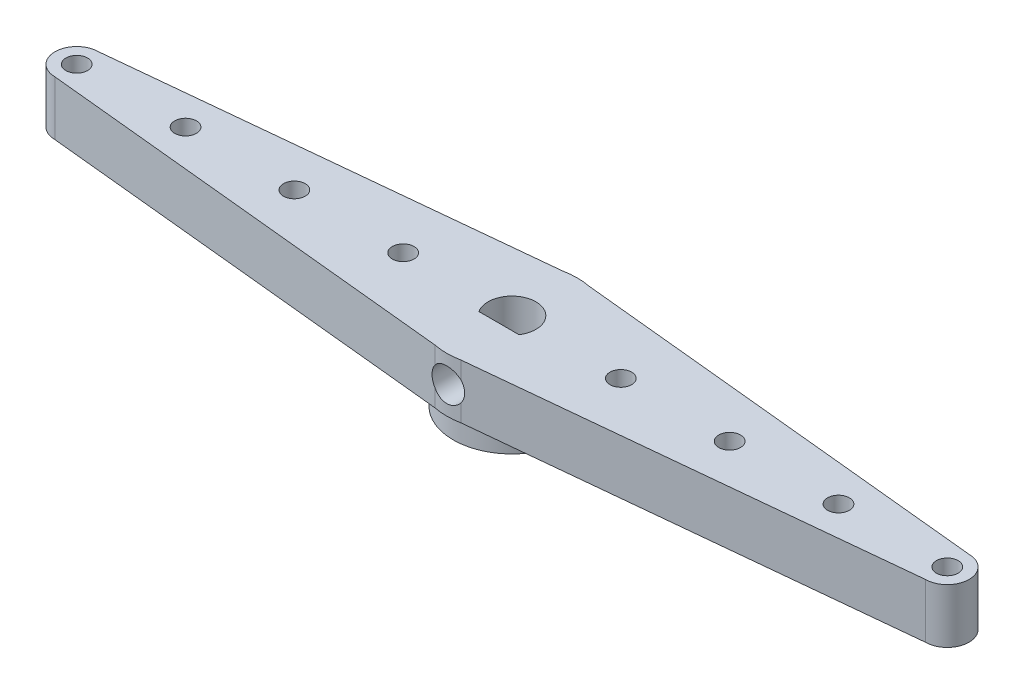
ISO-10303-21;
HEADER;
FILE_DESCRIPTION(('STEP AP214'),'2;1');
FILE_NAME('part.step','',(''),(''),'','','');
FILE_SCHEMA(('AUTOMOTIVE_DESIGN { 1 0 10303 214 1 1 1 1 }'));
ENDSEC;
DATA;
#1=APPLICATION_CONTEXT('core data for automotive mechanical design processes');
#2=APPLICATION_PROTOCOL_DEFINITION('international standard','automotive_design',2000,#1);
#3=PRODUCT_CONTEXT('',#1,'mechanical');
#4=PRODUCT('Part','Part','',(#3));
#5=PRODUCT_RELATED_PRODUCT_CATEGORY('part','',(#4));
#6=PRODUCT_DEFINITION_FORMATION('','',#4);
#7=PRODUCT_DEFINITION_CONTEXT('part definition',#1,'design');
#8=PRODUCT_DEFINITION('design','',#6,#7);
#9=PRODUCT_DEFINITION_SHAPE('','',#8);
#10=(LENGTH_UNIT() NAMED_UNIT(*) SI_UNIT(.MILLI.,.METRE.));
#11=(NAMED_UNIT(*) PLANE_ANGLE_UNIT() SI_UNIT($,.RADIAN.));
#12=(NAMED_UNIT(*) SI_UNIT($,.STERADIAN.) SOLID_ANGLE_UNIT());
#13=UNCERTAINTY_MEASURE_WITH_UNIT(LENGTH_MEASURE(1.E-05),#10,'distance_accuracy_value','');
#14=(GEOMETRIC_REPRESENTATION_CONTEXT(3) GLOBAL_UNCERTAINTY_ASSIGNED_CONTEXT((#13)) GLOBAL_UNIT_ASSIGNED_CONTEXT((#10,
#11,#12)) REPRESENTATION_CONTEXT('',''));
#15=CARTESIAN_POINT('',(0.,0.,0.));
#16=DIRECTION('',(0.,0.,1.));
#17=DIRECTION('',(1.,0.,0.));
#18=AXIS2_PLACEMENT_3D('',#15,#16,#17);
#19=CARTESIAN_POINT('',(-20.,0.,0.));
#20=DIRECTION('',(0.,-1.,0.));
#21=DIRECTION('',(0.,0.,-1.));
#22=AXIS2_PLACEMENT_3D('',#19,#20,#21);
#23=PLANE('',#22);
#24=DIRECTION('',(1.,0.,0.));
#25=VECTOR('',#24,1.);
#26=CARTESIAN_POINT('',(-0.921954445729289,0.,0.6));
#27=LINE('',#26,#25);
#28=CARTESIAN_POINT('',(-0.921954445729289,0.,0.6));
#29=VERTEX_POINT('',#28);
#30=CARTESIAN_POINT('',(0.921954445729286,0.,0.6));
#31=VERTEX_POINT('',#30);
#32=EDGE_CURVE('E285',#29,#31,#27,.T.);
#33=ORIENTED_EDGE('',*,*,#32,.T.);
#34=CARTESIAN_POINT('',(0.,0.,0.));
#35=DIRECTION('',(0.,1.,0.));
#36=DIRECTION('',(0.,0.,1.));
#37=AXIS2_PLACEMENT_3D('',#34,#35,#36);
#38=CIRCLE('',#37,1.1);
#39=EDGE_CURVE('E483',#31,#29,#38,.T.);
#40=ORIENTED_EDGE('',*,*,#39,.T.);
#41=EDGE_LOOP('',(#33,#40));
#42=FACE_BOUND('',#41,.T.);
#43=CARTESIAN_POINT('',(0.,0.,0.));
#44=DIRECTION('',(0.,1.,0.));
#45=DIRECTION('',(0.,0.,1.));
#46=AXIS2_PLACEMENT_3D('',#43,#44,#45);
#47=CIRCLE('',#46,2.);
#48=CARTESIAN_POINT('',(0.,0.,2.));
#49=VERTEX_POINT('',#48);
#50=EDGE_CURVE('E182',#49,#49,#47,.T.);
#51=ORIENTED_EDGE('',*,*,#50,.F.);
#52=EDGE_LOOP('',(#51));
#53=FACE_BOUND('',#52,.T.);
#54=ADVANCED_FACE('F43',(#42,#53),#23,.T.);
#55=CARTESIAN_POINT('',(0.,2.5,0.));
#56=DIRECTION('',(0.,-1.,0.));
#57=DIRECTION('',(0.,0.,-1.));
#58=AXIS2_PLACEMENT_3D('',#55,#56,#57);
#59=CYLINDRICAL_SURFACE('',#58,3.);
#60=CARTESIAN_POINT('',(-0.594059405940595,0.792186258164407,2.94059405940594));
#61=CARTESIAN_POINT('',(-0.568276606003734,0.758685202406999,2.94581106956322));
#62=CARTESIAN_POINT('',(-0.539639583970828,0.727423837590144,2.95123654479784));
#63=CARTESIAN_POINT('',(-0.477504194017472,0.670115946895208,2.9619198478612));
#64=CARTESIAN_POINT('',(-0.444004007325869,0.644071380754388,2.96717761206652));
#65=CARTESIAN_POINT('',(-0.372982275206844,0.597940773804355,2.9769399353054));
#66=CARTESIAN_POINT('',(-0.335457608352631,0.577859404272306,2.98144390265242));
#67=CARTESIAN_POINT('',(-0.257462397587267,0.544299578450418,2.98918804670013));
#68=CARTESIAN_POINT('',(-0.216993648353223,0.530817137637052,2.99242898579306));
#69=CARTESIAN_POINT('',(-0.134922093114569,0.511048517968992,2.99724177000638));
#70=CARTESIAN_POINT('',(-0.0933476403781332,0.504651073231695,2.99883939311242));
#71=CARTESIAN_POINT('',(-0.0096789665313658,0.498891270089852,3.00027600152797));
#72=CARTESIAN_POINT('',(0.032415276965879,0.499529215756191,3.00011491082555));
#73=CARTESIAN_POINT('',(0.114922578095821,0.507724185212947,2.99807584676848));
#74=CARTESIAN_POINT('',(0.155352171573688,0.51512585034932,2.99623642512177));
#75=CARTESIAN_POINT('',(0.234381817821163,0.536389625219354,2.99109247997884));
#76=CARTESIAN_POINT('',(0.272981555374788,0.550252843614597,2.98778770506471));
#77=CARTESIAN_POINT('',(0.347658596899154,0.584168170241157,2.98002646408354));
#78=CARTESIAN_POINT('',(0.383709245627547,0.604276376264111,2.9755596208857));
#79=CARTESIAN_POINT('',(0.451956317255789,0.650065937581668,2.96596064509335));
#80=CARTESIAN_POINT('',(0.484155823111139,0.675742788047969,2.96082905160077));
#81=CARTESIAN_POINT('',(0.528515219108444,0.717487518749236,2.95311525900234));
#82=CARTESIAN_POINT('',(0.542464902419456,0.731706077476062,2.95057916647666));
#83=CARTESIAN_POINT('',(0.569166888450158,0.761181830901836,2.94554454049115));
#84=CARTESIAN_POINT('',(0.581921442077907,0.776436975791388,2.94304594418521));
#85=CARTESIAN_POINT('',(0.594059405940596,0.792186258164408,2.94059405940594));
#86=B_SPLINE_CURVE_WITH_KNOTS('',3,(#60,#61,#62,#63,#64,#65,#66,#67,#68,#69,#70,#71,#72,#73,#74,
#75,#76,#77,#78,#79,#80,#81,#82,#83,#84,#85),.UNSPECIFIED.,.F.,.F.,(4,2,2,2,2,2,2,2,2,2,2,2,4),
(0.,0.127625211159938,0.255298276329441,0.383071092101845,0.510766661426294,0.636427081665982,
0.762092932993769,0.884942943019022,1.00781403918979,1.13182245380267,1.25573092190355,
1.31591641640539,1.37598617787841),.UNSPECIFIED.);
#87=CARTESIAN_POINT('',(-0.594059405940595,0.792186258164407,2.94059405940594));
#88=VERTEX_POINT('',#87);
#89=CARTESIAN_POINT('',(0.594059405940597,0.792186258164409,2.94059405940594));
#90=VERTEX_POINT('',#89);
#91=EDGE_CURVE('E59',#88,#90,#86,.T.);
#92=ORIENTED_EDGE('',*,*,#91,.F.);
#93=DIRECTION('',(0.,-1.,0.));
#94=VECTOR('',#93,1.);
#95=CARTESIAN_POINT('',(-0.594059405940597,2.5,2.94059405940594));
#96=LINE('',#95,#94);
#97=CARTESIAN_POINT('',(-0.594059405940597,0.,2.94059405940594));
#98=VERTEX_POINT('',#97);
#99=EDGE_CURVE('E156',#88,#98,#96,.T.);
#100=ORIENTED_EDGE('',*,*,#99,.T.);
#101=CARTESIAN_POINT('',(0.,0.,0.));
#102=DIRECTION('',(0.,1.,0.));
#103=DIRECTION('',(0.,0.,1.));
#104=AXIS2_PLACEMENT_3D('',#101,#102,#103);
#105=CIRCLE('',#104,3.);
#106=CARTESIAN_POINT('',(0.594059405940597,0.,2.94059405940594));
#107=VERTEX_POINT('',#106);
#108=EDGE_CURVE('E430',#98,#107,#105,.T.);
#109=ORIENTED_EDGE('',*,*,#108,.T.);
#110=DIRECTION('',(0.,-1.,0.));
#111=VECTOR('',#110,1.);
#112=CARTESIAN_POINT('',(0.594059405940597,2.5,2.94059405940594));
#113=LINE('',#112,#111);
#114=EDGE_CURVE('E157',#90,#107,#113,.T.);
#115=ORIENTED_EDGE('',*,*,#114,.F.);
#116=EDGE_LOOP('',(#92,#100,#109,#115));
#117=FACE_BOUND('',#116,.T.);
#118=ADVANCED_FACE('F197',(#117),#59,.T.);
#119=CARTESIAN_POINT('',(0.594059405940596,1.70781374183559,2.94059405940594));
#120=CARTESIAN_POINT('',(0.568276606003735,1.741314797593,2.94581106956322));
#121=CARTESIAN_POINT('',(0.539639583970829,1.77257616240986,2.95123654479784));
#122=CARTESIAN_POINT('',(0.477504194017473,1.82988405310479,2.9619198478612));
#123=CARTESIAN_POINT('',(0.44400400732587,1.85592861924561,2.96717761206652));
#124=CARTESIAN_POINT('',(0.372982275206845,1.90205922619564,2.9769399353054));
#125=CARTESIAN_POINT('',(0.335457608352632,1.92214059572769,2.98144390265242));
#126=CARTESIAN_POINT('',(0.257462397587268,1.95570042154958,2.98918804670013));
#127=CARTESIAN_POINT('',(0.216993648353224,1.96918286236295,2.99242898579306));
#128=CARTESIAN_POINT('',(0.13492209311457,1.98895148203101,2.99724177000638));
#129=CARTESIAN_POINT('',(0.0933476403781343,1.9953489267683,2.99883939311242));
#130=CARTESIAN_POINT('',(0.00967896653136686,2.00110872991015,3.00027600152797));
#131=CARTESIAN_POINT('',(-0.032415276965878,2.00047078424381,3.00011491082555));
#132=CARTESIAN_POINT('',(-0.11492257809582,1.99227581478705,2.99807584676848));
#133=CARTESIAN_POINT('',(-0.155352171573687,1.98487414965068,2.99623642512177));
#134=CARTESIAN_POINT('',(-0.234381817821162,1.96361037478065,2.99109247997884));
#135=CARTESIAN_POINT('',(-0.272981555374787,1.9497471563854,2.98778770506471));
#136=CARTESIAN_POINT('',(-0.347658596899153,1.91583182975884,2.98002646408354));
#137=CARTESIAN_POINT('',(-0.383709245627546,1.89572362373589,2.9755596208857));
#138=CARTESIAN_POINT('',(-0.451956317255788,1.84993406241833,2.96596064509336));
#139=CARTESIAN_POINT('',(-0.484155823111139,1.82425721195203,2.96082905160077));
#140=CARTESIAN_POINT('',(-0.528515219108443,1.78251248125076,2.95311525900234));
#141=CARTESIAN_POINT('',(-0.542464902419456,1.76829392252394,2.95057916647666));
#142=CARTESIAN_POINT('',(-0.569166888450157,1.73881816909816,2.94554454049115));
#143=CARTESIAN_POINT('',(-0.581921442077906,1.72356302420861,2.94304594418521));
#144=CARTESIAN_POINT('',(-0.594059405940595,1.70781374183559,2.94059405940594));
#145=B_SPLINE_CURVE_WITH_KNOTS('',3,(#119,#120,#121,#122,#123,#124,#125,#126,#127,#128,#129,
#130,#131,#132,#133,#134,#135,#136,#137,#138,#139,#140,#141,#142,#143,#144),.UNSPECIFIED.,.F.,
.F.,(4,2,2,2,2,2,2,2,2,2,2,2,4),(0.,0.127625211159938,0.255298276329441,0.383071092101845,
0.510766661426294,0.636427081665982,0.762092932993769,0.884942943019022,1.00781403918979,
1.13182245380267,1.25573092190355,1.31591641640539,1.37598617787841),.UNSPECIFIED.);
#146=CARTESIAN_POINT('',(0.594059405940597,1.70781374183559,2.94059405940594));
#147=VERTEX_POINT('',#146);
#148=CARTESIAN_POINT('',(-0.594059405940595,1.70781374183559,2.94059405940594));
#149=VERTEX_POINT('',#148);
#150=EDGE_CURVE('E133',#147,#149,#145,.T.);
#151=ORIENTED_EDGE('',*,*,#150,.F.);
#152=CARTESIAN_POINT('',(0.594059405940597,2.5,2.94059405940594));
#153=VERTEX_POINT('',#152);
#154=EDGE_CURVE('E146',#153,#147,#113,.T.);
#155=ORIENTED_EDGE('',*,*,#154,.F.);
#156=CARTESIAN_POINT('',(0.,2.5,0.));
#157=DIRECTION('',(0.,1.,0.));
#158=DIRECTION('',(0.,0.,1.));
#159=AXIS2_PLACEMENT_3D('',#156,#157,#158);
#160=CIRCLE('',#159,3.);
#161=CARTESIAN_POINT('',(-0.594059405940597,2.5,2.94059405940594));
#162=VERTEX_POINT('',#161);
#163=EDGE_CURVE('E406',#162,#153,#160,.T.);
#164=ORIENTED_EDGE('',*,*,#163,.F.);
#165=EDGE_CURVE('E149',#162,#149,#96,.T.);
#166=ORIENTED_EDGE('',*,*,#165,.T.);
#167=EDGE_LOOP('',(#151,#155,#164,#166));
#168=FACE_BOUND('',#167,.T.);
#169=ADVANCED_FACE('F144',(#168),#59,.T.);
#170=CARTESIAN_POINT('',(-20.,2.5,0.));
#171=DIRECTION('',(0.,-1.,0.));
#172=DIRECTION('',(0.,0.,-1.));
#173=AXIS2_PLACEMENT_3D('',#170,#171,#172);
#174=PLANE('',#173);
#175=CARTESIAN_POINT('',(-5.,2.5,0.));
#176=DIRECTION('',(0.,1.,0.));
#177=DIRECTION('',(0.,0.,-1.));
#178=AXIS2_PLACEMENT_3D('',#175,#176,#177);
#179=CIRCLE('',#178,0.500000000000001);
#180=CARTESIAN_POINT('',(-5.,2.5,-0.500000000000001));
#181=VERTEX_POINT('',#180);
#182=EDGE_CURVE('E347',#181,#181,#179,.T.);
#183=ORIENTED_EDGE('',*,*,#182,.F.);
#184=EDGE_LOOP('',(#183));
#185=FACE_BOUND('',#184,.T.);
#186=CARTESIAN_POINT('',(-10.,2.5,0.));
#187=DIRECTION('',(0.,1.,0.));
#188=DIRECTION('',(0.,0.,-1.));
#189=AXIS2_PLACEMENT_3D('',#186,#187,#188);
#190=CIRCLE('',#189,0.500000000000001);
#191=CARTESIAN_POINT('',(-10.,2.5,-0.500000000000001));
#192=VERTEX_POINT('',#191);
#193=EDGE_CURVE('E356',#192,#192,#190,.T.);
#194=ORIENTED_EDGE('',*,*,#193,.F.);
#195=EDGE_LOOP('',(#194));
#196=FACE_BOUND('',#195,.T.);
#197=CARTESIAN_POINT('',(-15.,2.5,0.));
#198=DIRECTION('',(0.,1.,0.));
#199=DIRECTION('',(0.,0.,-1.));
#200=AXIS2_PLACEMENT_3D('',#197,#198,#199);
#201=CIRCLE('',#200,0.500000000000002);
#202=CARTESIAN_POINT('',(-15.,2.5,-0.500000000000002));
#203=VERTEX_POINT('',#202);
#204=EDGE_CURVE('E362',#203,#203,#201,.T.);
#205=ORIENTED_EDGE('',*,*,#204,.F.);
#206=EDGE_LOOP('',(#205));
#207=FACE_BOUND('',#206,.T.);
#208=CARTESIAN_POINT('',(20.,2.5,0.));
#209=DIRECTION('',(0.,1.,0.));
#210=DIRECTION('',(0.,0.,1.));
#211=AXIS2_PLACEMENT_3D('',#208,#209,#210);
#212=CIRCLE('',#211,0.499999999999999);
#213=CARTESIAN_POINT('',(20.,2.5,0.499999999999999));
#214=VERTEX_POINT('',#213);
#215=EDGE_CURVE('E368',#214,#214,#212,.T.);
#216=ORIENTED_EDGE('',*,*,#215,.F.);
#217=EDGE_LOOP('',(#216));
#218=FACE_BOUND('',#217,.T.);
#219=CARTESIAN_POINT('',(15.,2.5,0.));
#220=DIRECTION('',(0.,1.,0.));
#221=DIRECTION('',(0.,0.,1.));
#222=AXIS2_PLACEMENT_3D('',#219,#220,#221);
#223=CIRCLE('',#222,0.500000000000002);
#224=CARTESIAN_POINT('',(15.,2.5,0.500000000000002));
#225=VERTEX_POINT('',#224);
#226=EDGE_CURVE('E374',#225,#225,#223,.T.);
#227=ORIENTED_EDGE('',*,*,#226,.F.);
#228=EDGE_LOOP('',(#227));
#229=FACE_BOUND('',#228,.T.);
#230=CARTESIAN_POINT('',(10.,2.5,0.));
#231=DIRECTION('',(0.,1.,0.));
#232=DIRECTION('',(0.,0.,1.));
#233=AXIS2_PLACEMENT_3D('',#230,#231,#232);
#234=CIRCLE('',#233,0.500000000000001);
#235=CARTESIAN_POINT('',(10.,2.5,0.500000000000001));
#236=VERTEX_POINT('',#235);
#237=EDGE_CURVE('E380',#236,#236,#234,.T.);
#238=ORIENTED_EDGE('',*,*,#237,.F.);
#239=EDGE_LOOP('',(#238));
#240=FACE_BOUND('',#239,.T.);
#241=CARTESIAN_POINT('',(-20.,2.5,0.));
#242=DIRECTION('',(0.,1.,0.));
#243=DIRECTION('',(0.,0.,-1.));
#244=AXIS2_PLACEMENT_3D('',#241,#242,#243);
#245=CIRCLE('',#244,0.499999999999999);
#246=CARTESIAN_POINT('',(-20.,2.5,-0.499999999999999));
#247=VERTEX_POINT('',#246);
#248=EDGE_CURVE('E386',#247,#247,#245,.T.);
#249=ORIENTED_EDGE('',*,*,#248,.F.);
#250=EDGE_LOOP('',(#249));
#251=FACE_BOUND('',#250,.T.);
#252=CARTESIAN_POINT('',(5.,2.5,0.));
#253=DIRECTION('',(0.,1.,0.));
#254=DIRECTION('',(0.,0.,1.));
#255=AXIS2_PLACEMENT_3D('',#252,#253,#254);
#256=CIRCLE('',#255,0.500000000000001);
#257=CARTESIAN_POINT('',(5.,2.5,0.500000000000001));
#258=VERTEX_POINT('',#257);
#259=EDGE_CURVE('E392',#258,#258,#256,.T.);
#260=ORIENTED_EDGE('',*,*,#259,.F.);
#261=EDGE_LOOP('',(#260));
#262=FACE_BOUND('',#261,.T.);
#263=CARTESIAN_POINT('',(-20.,2.5,0.));
#264=DIRECTION('',(0.,1.,0.));
#265=DIRECTION('',(0.,0.,-1.));
#266=AXIS2_PLACEMENT_3D('',#263,#264,#265);
#267=CIRCLE('',#266,1.);
#268=CARTESIAN_POINT('',(-20.,2.5,-1.));
#269=VERTEX_POINT('',#268);
#270=CARTESIAN_POINT('',(-20.,2.5,1.));
#271=VERTEX_POINT('',#270);
#272=EDGE_CURVE('E398',#269,#271,#267,.T.);
#273=ORIENTED_EDGE('',*,*,#272,.T.);
#274=DIRECTION('',(0.995037190209989,0.,0.0995037190209989));
#275=VECTOR('',#274,1.);
#276=CARTESIAN_POINT('',(-0.594059405940597,2.5,2.94059405940594));
#277=LINE('',#276,#275);
#278=EDGE_CURVE('E402',#271,#162,#277,.T.);
#279=ORIENTED_EDGE('',*,*,#278,.T.);
#280=ORIENTED_EDGE('',*,*,#163,.T.);
#281=DIRECTION('',(0.995037190209989,0.,-0.0995037190209989));
#282=VECTOR('',#281,1.);
#283=CARTESIAN_POINT('',(0.594059405940597,2.5,2.94059405940594));
#284=LINE('',#283,#282);
#285=CARTESIAN_POINT('',(20.,2.5,1.));
#286=VERTEX_POINT('',#285);
#287=EDGE_CURVE('E154',#153,#286,#284,.T.);
#288=ORIENTED_EDGE('',*,*,#287,.T.);
#289=CARTESIAN_POINT('',(20.,2.5,0.));
#290=DIRECTION('',(0.,1.,0.));
#291=DIRECTION('',(0.,0.,1.));
#292=AXIS2_PLACEMENT_3D('',#289,#290,#291);
#293=CIRCLE('',#292,1.);
#294=CARTESIAN_POINT('',(20.,2.5,-1.));
#295=VERTEX_POINT('',#294);
#296=EDGE_CURVE('E411',#286,#295,#293,.T.);
#297=ORIENTED_EDGE('',*,*,#296,.T.);
#298=DIRECTION('',(-0.995037190209989,0.,-0.0995037190209989));
#299=VECTOR('',#298,1.);
#300=CARTESIAN_POINT('',(0.594059405940597,2.5,-2.94059405940594));
#301=LINE('',#300,#299);
#302=CARTESIAN_POINT('',(0.594059405940596,2.5,-2.94059405940594));
#303=VERTEX_POINT('',#302);
#304=EDGE_CURVE('E414',#295,#303,#301,.T.);
#305=ORIENTED_EDGE('',*,*,#304,.T.);
#306=CARTESIAN_POINT('',(0.,2.5,0.));
#307=DIRECTION('',(0.,1.,0.));
#308=DIRECTION('',(0.,0.,1.));
#309=AXIS2_PLACEMENT_3D('',#306,#307,#308);
#310=CIRCLE('',#309,3.);
#311=CARTESIAN_POINT('',(-0.594059405940597,2.5,-2.94059405940594));
#312=VERTEX_POINT('',#311);
#313=EDGE_CURVE('E417',#303,#312,#310,.T.);
#314=ORIENTED_EDGE('',*,*,#313,.T.);
#315=DIRECTION('',(-0.995037190209989,0.,0.0995037190209989));
#316=VECTOR('',#315,1.);
#317=CARTESIAN_POINT('',(-0.594059405940597,2.5,-2.94059405940594));
#318=LINE('',#317,#316);
#319=EDGE_CURVE('E420',#312,#269,#318,.T.);
#320=ORIENTED_EDGE('',*,*,#319,.T.);
#321=EDGE_LOOP('',(#273,#279,#280,#288,#297,#305,#314,#320));
#322=FACE_BOUND('',#321,.T.);
#323=CARTESIAN_POINT('',(0.,2.5,0.));
#324=DIRECTION('',(0.,1.,0.));
#325=DIRECTION('',(0.,0.,1.));
#326=AXIS2_PLACEMENT_3D('',#323,#324,#325);
#327=CIRCLE('',#326,1.1);
#328=CARTESIAN_POINT('',(0.921954445729289,2.5,0.6));
#329=VERTEX_POINT('',#328);
#330=CARTESIAN_POINT('',(-0.921954445729286,2.5,0.6));
#331=VERTEX_POINT('',#330);
#332=EDGE_CURVE('E488',#329,#331,#327,.T.);
#333=ORIENTED_EDGE('',*,*,#332,.F.);
#334=DIRECTION('',(1.,0.,0.));
#335=VECTOR('',#334,1.);
#336=CARTESIAN_POINT('',(-0.921954445729289,2.5,0.6));
#337=LINE('',#336,#335);
#338=EDGE_CURVE('E491',#331,#329,#337,.T.);
#339=ORIENTED_EDGE('',*,*,#338,.F.);
#340=EDGE_LOOP('',(#333,#339));
#341=FACE_BOUND('',#340,.T.);
#342=ADVANCED_FACE('F248',(#185,#196,#207,#218,#229,#240,#251,#262,#322,#341),#174,.F.);
#343=CARTESIAN_POINT('',(0.,0.,0.));
#344=DIRECTION('',(0.,-1.,0.));
#345=DIRECTION('',(0.,0.,-1.));
#346=AXIS2_PLACEMENT_3D('',#343,#344,#345);
#347=CIRCLE('',#346,2.7);
#348=CARTESIAN_POINT('',(0.,0.,-2.7));
#349=VERTEX_POINT('',#348);
#350=EDGE_CURVE('E11',#349,#349,#347,.T.);
#351=ORIENTED_EDGE('',*,*,#350,.F.);
#352=EDGE_LOOP('',(#351));
#353=FACE_BOUND('',#352,.T.);
#354=CARTESIAN_POINT('',(-10.,0.,0.));
#355=DIRECTION('',(0.,1.,0.));
#356=DIRECTION('',(0.,0.,-1.));
#357=AXIS2_PLACEMENT_3D('',#354,#355,#356);
#358=CIRCLE('',#357,0.500000000000001);
#359=CARTESIAN_POINT('',(-10.,0.,-0.500000000000001));
#360=VERTEX_POINT('',#359);
#361=EDGE_CURVE('E312',#360,#360,#358,.T.);
#362=ORIENTED_EDGE('',*,*,#361,.T.);
#363=EDGE_LOOP('',(#362));
#364=FACE_BOUND('',#363,.T.);
#365=CARTESIAN_POINT('',(20.,0.,0.));
#366=DIRECTION('',(0.,1.,0.));
#367=DIRECTION('',(0.,0.,1.));
#368=AXIS2_PLACEMENT_3D('',#365,#366,#367);
#369=CIRCLE('',#368,0.499999999999999);
#370=CARTESIAN_POINT('',(20.,0.,0.499999999999999));
#371=VERTEX_POINT('',#370);
#372=EDGE_CURVE('E316',#371,#371,#369,.T.);
#373=ORIENTED_EDGE('',*,*,#372,.T.);
#374=EDGE_LOOP('',(#373));
#375=FACE_BOUND('',#374,.T.);
#376=CARTESIAN_POINT('',(10.,0.,0.));
#377=DIRECTION('',(0.,1.,0.));
#378=DIRECTION('',(0.,0.,1.));
#379=AXIS2_PLACEMENT_3D('',#376,#377,#378);
#380=CIRCLE('',#379,0.500000000000001);
#381=CARTESIAN_POINT('',(10.,0.,0.500000000000001));
#382=VERTEX_POINT('',#381);
#383=EDGE_CURVE('E320',#382,#382,#380,.T.);
#384=ORIENTED_EDGE('',*,*,#383,.T.);
#385=EDGE_LOOP('',(#384));
#386=FACE_BOUND('',#385,.T.);
#387=CARTESIAN_POINT('',(5.,0.,0.));
#388=DIRECTION('',(0.,1.,0.));
#389=DIRECTION('',(0.,0.,1.));
#390=AXIS2_PLACEMENT_3D('',#387,#388,#389);
#391=CIRCLE('',#390,0.500000000000001);
#392=CARTESIAN_POINT('',(5.,0.,0.500000000000001));
#393=VERTEX_POINT('',#392);
#394=EDGE_CURVE('E324',#393,#393,#391,.T.);
#395=ORIENTED_EDGE('',*,*,#394,.T.);
#396=EDGE_LOOP('',(#395));
#397=FACE_BOUND('',#396,.T.);
#398=CARTESIAN_POINT('',(-20.,0.,0.));
#399=DIRECTION('',(0.,1.,0.));
#400=DIRECTION('',(0.,0.,-1.));
#401=AXIS2_PLACEMENT_3D('',#398,#399,#400);
#402=CIRCLE('',#401,1.);
#403=CARTESIAN_POINT('',(-20.,0.,-1.));
#404=VERTEX_POINT('',#403);
#405=CARTESIAN_POINT('',(-20.,0.,1.));
#406=VERTEX_POINT('',#405);
#407=EDGE_CURVE('E329',#404,#406,#402,.T.);
#408=ORIENTED_EDGE('',*,*,#407,.F.);
#409=DIRECTION('',(-0.995037190209989,0.,0.0995037190209989));
#410=VECTOR('',#409,1.);
#411=CARTESIAN_POINT('',(-0.594059405940597,0.,-2.94059405940594));
#412=LINE('',#411,#410);
#413=CARTESIAN_POINT('',(-0.594059405940597,0.,-2.94059405940594));
#414=VERTEX_POINT('',#413);
#415=EDGE_CURVE('E403',#414,#404,#412,.T.);
#416=ORIENTED_EDGE('',*,*,#415,.F.);
#417=CARTESIAN_POINT('',(0.,0.,0.));
#418=DIRECTION('',(0.,1.,0.));
#419=DIRECTION('',(0.,0.,1.));
#420=AXIS2_PLACEMENT_3D('',#417,#418,#419);
#421=CIRCLE('',#420,3.);
#422=CARTESIAN_POINT('',(0.594059405940596,0.,-2.94059405940594));
#423=VERTEX_POINT('',#422);
#424=EDGE_CURVE('E443',#423,#414,#421,.T.);
#425=ORIENTED_EDGE('',*,*,#424,.F.);
#426=DIRECTION('',(-0.995037190209989,0.,-0.0995037190209989));
#427=VECTOR('',#426,1.);
#428=CARTESIAN_POINT('',(0.594059405940597,0.,-2.94059405940594));
#429=LINE('',#428,#427);
#430=CARTESIAN_POINT('',(20.,0.,-1.));
#431=VERTEX_POINT('',#430);
#432=EDGE_CURVE('E440',#431,#423,#429,.T.);
#433=ORIENTED_EDGE('',*,*,#432,.F.);
#434=CARTESIAN_POINT('',(20.,0.,0.));
#435=DIRECTION('',(0.,1.,0.));
#436=DIRECTION('',(0.,0.,1.));
#437=AXIS2_PLACEMENT_3D('',#434,#435,#436);
#438=CIRCLE('',#437,1.);
#439=CARTESIAN_POINT('',(20.,0.,1.));
#440=VERTEX_POINT('',#439);
#441=EDGE_CURVE('E437',#440,#431,#438,.T.);
#442=ORIENTED_EDGE('',*,*,#441,.F.);
#443=DIRECTION('',(0.995037190209989,0.,-0.0995037190209989));
#444=VECTOR('',#443,1.);
#445=CARTESIAN_POINT('',(0.594059405940597,0.,2.94059405940594));
#446=LINE('',#445,#444);
#447=EDGE_CURVE('E434',#107,#440,#446,.T.);
#448=ORIENTED_EDGE('',*,*,#447,.F.);
#449=ORIENTED_EDGE('',*,*,#108,.F.);
#450=DIRECTION('',(0.995037190209989,0.,0.0995037190209989));
#451=VECTOR('',#450,1.);
#452=CARTESIAN_POINT('',(-0.594059405940597,0.,2.94059405940594));
#453=LINE('',#452,#451);
#454=EDGE_CURVE('E426',#406,#98,#453,.T.);
#455=ORIENTED_EDGE('',*,*,#454,.F.);
#456=EDGE_LOOP('',(#408,#416,#425,#433,#442,#448,#449,#455));
#457=FACE_BOUND('',#456,.T.);
#458=CARTESIAN_POINT('',(-20.,0.,0.));
#459=DIRECTION('',(0.,1.,0.));
#460=DIRECTION('',(0.,0.,-1.));
#461=AXIS2_PLACEMENT_3D('',#458,#459,#460);
#462=CIRCLE('',#461,0.499999999999999);
#463=CARTESIAN_POINT('',(-20.,0.,-0.499999999999999));
#464=VERTEX_POINT('',#463);
#465=EDGE_CURVE('E333',#464,#464,#462,.T.);
#466=ORIENTED_EDGE('',*,*,#465,.T.);
#467=EDGE_LOOP('',(#466));
#468=FACE_BOUND('',#467,.T.);
#469=CARTESIAN_POINT('',(15.,0.,0.));
#470=DIRECTION('',(0.,1.,0.));
#471=DIRECTION('',(0.,0.,1.));
#472=AXIS2_PLACEMENT_3D('',#469,#470,#471);
#473=CIRCLE('',#472,0.500000000000002);
#474=CARTESIAN_POINT('',(15.,0.,0.500000000000002));
#475=VERTEX_POINT('',#474);
#476=EDGE_CURVE('E337',#475,#475,#473,.T.);
#477=ORIENTED_EDGE('',*,*,#476,.T.);
#478=EDGE_LOOP('',(#477));
#479=FACE_BOUND('',#478,.T.);
#480=CARTESIAN_POINT('',(-15.,0.,0.));
#481=DIRECTION('',(0.,1.,0.));
#482=DIRECTION('',(0.,0.,-1.));
#483=AXIS2_PLACEMENT_3D('',#480,#481,#482);
#484=CIRCLE('',#483,0.500000000000002);
#485=CARTESIAN_POINT('',(-15.,0.,-0.500000000000002));
#486=VERTEX_POINT('',#485);
#487=EDGE_CURVE('E341',#486,#486,#484,.T.);
#488=ORIENTED_EDGE('',*,*,#487,.T.);
#489=EDGE_LOOP('',(#488));
#490=FACE_BOUND('',#489,.T.);
#491=CARTESIAN_POINT('',(-5.,0.,0.));
#492=DIRECTION('',(0.,1.,0.));
#493=DIRECTION('',(0.,0.,-1.));
#494=AXIS2_PLACEMENT_3D('',#491,#492,#493);
#495=CIRCLE('',#494,0.500000000000001);
#496=CARTESIAN_POINT('',(-5.,0.,-0.500000000000001));
#497=VERTEX_POINT('',#496);
#498=EDGE_CURVE('E344',#497,#497,#495,.T.);
#499=ORIENTED_EDGE('',*,*,#498,.T.);
#500=EDGE_LOOP('',(#499));
#501=FACE_BOUND('',#500,.T.);
#502=ADVANCED_FACE('F251',(#353,#364,#375,#386,#397,#457,#468,#479,#490,#501),#23,.T.);
#503=CARTESIAN_POINT('',(-20.,2.5,0.));
#504=DIRECTION('',(0.,-1.,0.));
#505=DIRECTION('',(0.,0.,-1.));
#506=AXIS2_PLACEMENT_3D('',#503,#504,#505);
#507=CYLINDRICAL_SURFACE('',#506,1.);
#508=ORIENTED_EDGE('',*,*,#407,.T.);
#509=DIRECTION('',(0.,-1.,0.));
#510=VECTOR('',#509,1.);
#511=CARTESIAN_POINT('',(-20.,2.5,1.));
#512=LINE('',#511,#510);
#513=EDGE_CURVE('E52',#271,#406,#512,.T.);
#514=ORIENTED_EDGE('',*,*,#513,.F.);
#515=ORIENTED_EDGE('',*,*,#272,.F.);
#516=DIRECTION('',(0.,-1.,0.));
#517=VECTOR('',#516,1.);
#518=CARTESIAN_POINT('',(-20.,2.5,-1.));
#519=LINE('',#518,#517);
#520=EDGE_CURVE('E423',#269,#404,#519,.T.);
#521=ORIENTED_EDGE('',*,*,#520,.T.);
#522=EDGE_LOOP('',(#508,#514,#515,#521));
#523=FACE_BOUND('',#522,.T.);
#524=ADVANCED_FACE('F45',(#523),#507,.T.);
#525=CARTESIAN_POINT('',(-0.594059405940597,2.5,2.94059405940594));
#526=DIRECTION('',(0.0995037190209989,0.,-0.995037190209989));
#527=DIRECTION('',(-0.995037190209989,0.,-0.0995037190209989));
#528=AXIS2_PLACEMENT_3D('',#525,#526,#527);
#529=PLANE('',#528);
#530=CARTESIAN_POINT('',(0.,1.25,3.));
#531=DIRECTION('',(0.0995037190209989,0.,-0.995037190209989));
#532=DIRECTION('',(-0.995037190209989,0.,-0.0995037190209989));
#533=AXIS2_PLACEMENT_3D('',#530,#531,#532);
#534=ELLIPSE('',#533,0.753740671584067,0.75);
#535=EDGE_CURVE('E481',#149,#88,#534,.F.);
#536=ORIENTED_EDGE('',*,*,#535,.F.);
#537=ORIENTED_EDGE('',*,*,#165,.F.);
#538=ORIENTED_EDGE('',*,*,#278,.F.);
#539=ORIENTED_EDGE('',*,*,#513,.T.);
#540=ORIENTED_EDGE('',*,*,#454,.T.);
#541=ORIENTED_EDGE('',*,*,#99,.F.);
#542=EDGE_LOOP('',(#536,#537,#538,#539,#540,#541));
#543=FACE_BOUND('',#542,.T.);
#544=ADVANCED_FACE('F271',(#543),#529,.F.);
#545=CARTESIAN_POINT('',(0.594059405940597,2.5,2.94059405940594));
#546=DIRECTION('',(-0.0995037190209989,0.,-0.995037190209989));
#547=DIRECTION('',(-0.995037190209989,0.,0.0995037190209989));
#548=AXIS2_PLACEMENT_3D('',#545,#546,#547);
#549=PLANE('',#548);
#550=CARTESIAN_POINT('',(0.,1.25,3.));
#551=DIRECTION('',(-0.0995037190209989,0.,-0.995037190209989));
#552=DIRECTION('',(0.995037190209989,0.,-0.0995037190209989));
#553=AXIS2_PLACEMENT_3D('',#550,#551,#552);
#554=ELLIPSE('',#553,0.753740671584067,0.75);
#555=EDGE_CURVE('E130',#90,#147,#554,.F.);
#556=ORIENTED_EDGE('',*,*,#555,.F.);
#557=ORIENTED_EDGE('',*,*,#114,.T.);
#558=ORIENTED_EDGE('',*,*,#447,.T.);
#559=DIRECTION('',(0.,-1.,0.));
#560=VECTOR('',#559,1.);
#561=CARTESIAN_POINT('',(20.,2.5,1.));
#562=LINE('',#561,#560);
#563=EDGE_CURVE('E162',#286,#440,#562,.T.);
#564=ORIENTED_EDGE('',*,*,#563,.F.);
#565=ORIENTED_EDGE('',*,*,#287,.F.);
#566=ORIENTED_EDGE('',*,*,#154,.T.);
#567=EDGE_LOOP('',(#556,#557,#558,#564,#565,#566));
#568=FACE_BOUND('',#567,.T.);
#569=ADVANCED_FACE('F152',(#568),#549,.F.);
#570=CARTESIAN_POINT('',(20.,2.5,0.));
#571=DIRECTION('',(0.,-1.,0.));
#572=DIRECTION('',(0.,0.,-1.));
#573=AXIS2_PLACEMENT_3D('',#570,#571,#572);
#574=CYLINDRICAL_SURFACE('',#573,1.);
#575=ORIENTED_EDGE('',*,*,#441,.T.);
#576=DIRECTION('',(0.,-1.,0.));
#577=VECTOR('',#576,1.);
#578=CARTESIAN_POINT('',(20.,2.5,-1.));
#579=LINE('',#578,#577);
#580=EDGE_CURVE('E458',#295,#431,#579,.T.);
#581=ORIENTED_EDGE('',*,*,#580,.F.);
#582=ORIENTED_EDGE('',*,*,#296,.F.);
#583=ORIENTED_EDGE('',*,*,#563,.T.);
#584=EDGE_LOOP('',(#575,#581,#582,#583));
#585=FACE_BOUND('',#584,.T.);
#586=ADVANCED_FACE('F266',(#585),#574,.T.);
#587=CARTESIAN_POINT('',(0.594059405940597,2.5,-2.94059405940594));
#588=DIRECTION('',(-0.0995037190209989,0.,0.995037190209989));
#589=DIRECTION('',(0.995037190209989,0.,0.0995037190209989));
#590=AXIS2_PLACEMENT_3D('',#587,#588,#589);
#591=PLANE('',#590);
#592=ORIENTED_EDGE('',*,*,#432,.T.);
#593=DIRECTION('',(0.,-1.,0.));
#594=VECTOR('',#593,1.);
#595=CARTESIAN_POINT('',(0.594059405940596,2.5,-2.94059405940594));
#596=LINE('',#595,#594);
#597=EDGE_CURVE('E455',#303,#423,#596,.T.);
#598=ORIENTED_EDGE('',*,*,#597,.F.);
#599=ORIENTED_EDGE('',*,*,#304,.F.);
#600=ORIENTED_EDGE('',*,*,#580,.T.);
#601=EDGE_LOOP('',(#592,#598,#599,#600));
#602=FACE_BOUND('',#601,.T.);
#603=ADVANCED_FACE('F262',(#602),#591,.F.);
#604=CARTESIAN_POINT('',(0.,2.5,0.));
#605=DIRECTION('',(0.,-1.,0.));
#606=DIRECTION('',(0.,0.,-1.));
#607=AXIS2_PLACEMENT_3D('',#604,#605,#606);
#608=CYLINDRICAL_SURFACE('',#607,3.);
#609=ORIENTED_EDGE('',*,*,#424,.T.);
#610=DIRECTION('',(0.,-1.,0.));
#611=VECTOR('',#610,1.);
#612=CARTESIAN_POINT('',(-0.594059405940597,2.5,-2.94059405940594));
#613=LINE('',#612,#611);
#614=EDGE_CURVE('E451',#312,#414,#613,.T.);
#615=ORIENTED_EDGE('',*,*,#614,.F.);
#616=ORIENTED_EDGE('',*,*,#313,.F.);
#617=ORIENTED_EDGE('',*,*,#597,.T.);
#618=EDGE_LOOP('',(#609,#615,#616,#617));
#619=FACE_BOUND('',#618,.T.);
#620=ADVANCED_FACE('F258',(#619),#608,.T.);
#621=CARTESIAN_POINT('',(-0.594059405940597,2.5,-2.94059405940594));
#622=DIRECTION('',(0.0995037190209989,0.,0.995037190209989));
#623=DIRECTION('',(0.995037190209989,0.,-0.0995037190209989));
#624=AXIS2_PLACEMENT_3D('',#621,#622,#623);
#625=PLANE('',#624);
#626=ORIENTED_EDGE('',*,*,#415,.T.);
#627=ORIENTED_EDGE('',*,*,#520,.F.);
#628=ORIENTED_EDGE('',*,*,#319,.F.);
#629=ORIENTED_EDGE('',*,*,#614,.T.);
#630=EDGE_LOOP('',(#626,#627,#628,#629));
#631=FACE_BOUND('',#630,.T.);
#632=ADVANCED_FACE('F246',(#631),#625,.F.);
#633=CARTESIAN_POINT('',(5.,2.5,0.));
#634=DIRECTION('',(0.,-1.,0.));
#635=DIRECTION('',(0.,0.,-1.));
#636=AXIS2_PLACEMENT_3D('',#633,#634,#635);
#637=CYLINDRICAL_SURFACE('',#636,0.500000000000001);
#638=ORIENTED_EDGE('',*,*,#259,.T.);
#639=EDGE_LOOP('',(#638));
#640=FACE_BOUND('',#639,.T.);
#641=ORIENTED_EDGE('',*,*,#394,.F.);
#642=EDGE_LOOP('',(#641));
#643=FACE_BOUND('',#642,.T.);
#644=ADVANCED_FACE('F242',(#640,#643),#637,.F.);
#645=CARTESIAN_POINT('',(-20.,2.5,0.));
#646=DIRECTION('',(0.,-1.,0.));
#647=DIRECTION('',(0.,0.,-1.));
#648=AXIS2_PLACEMENT_3D('',#645,#646,#647);
#649=CYLINDRICAL_SURFACE('',#648,0.499999999999999);
#650=ORIENTED_EDGE('',*,*,#248,.T.);
#651=EDGE_LOOP('',(#650));
#652=FACE_BOUND('',#651,.T.);
#653=ORIENTED_EDGE('',*,*,#465,.F.);
#654=EDGE_LOOP('',(#653));
#655=FACE_BOUND('',#654,.T.);
#656=ADVANCED_FACE('F238',(#652,#655),#649,.F.);
#657=CARTESIAN_POINT('',(10.,2.5,0.));
#658=DIRECTION('',(0.,-1.,0.));
#659=DIRECTION('',(0.,0.,-1.));
#660=AXIS2_PLACEMENT_3D('',#657,#658,#659);
#661=CYLINDRICAL_SURFACE('',#660,0.500000000000001);
#662=ORIENTED_EDGE('',*,*,#237,.T.);
#663=EDGE_LOOP('',(#662));
#664=FACE_BOUND('',#663,.T.);
#665=ORIENTED_EDGE('',*,*,#383,.F.);
#666=EDGE_LOOP('',(#665));
#667=FACE_BOUND('',#666,.T.);
#668=ADVANCED_FACE('F234',(#664,#667),#661,.F.);
#669=CARTESIAN_POINT('',(15.,2.5,0.));
#670=DIRECTION('',(0.,-1.,0.));
#671=DIRECTION('',(0.,0.,-1.));
#672=AXIS2_PLACEMENT_3D('',#669,#670,#671);
#673=CYLINDRICAL_SURFACE('',#672,0.500000000000002);
#674=ORIENTED_EDGE('',*,*,#226,.T.);
#675=EDGE_LOOP('',(#674));
#676=FACE_BOUND('',#675,.T.);
#677=ORIENTED_EDGE('',*,*,#476,.F.);
#678=EDGE_LOOP('',(#677));
#679=FACE_BOUND('',#678,.T.);
#680=ADVANCED_FACE('F230',(#676,#679),#673,.F.);
#681=CARTESIAN_POINT('',(20.,2.5,0.));
#682=DIRECTION('',(0.,-1.,0.));
#683=DIRECTION('',(0.,0.,-1.));
#684=AXIS2_PLACEMENT_3D('',#681,#682,#683);
#685=CYLINDRICAL_SURFACE('',#684,0.499999999999999);
#686=ORIENTED_EDGE('',*,*,#215,.T.);
#687=EDGE_LOOP('',(#686));
#688=FACE_BOUND('',#687,.T.);
#689=ORIENTED_EDGE('',*,*,#372,.F.);
#690=EDGE_LOOP('',(#689));
#691=FACE_BOUND('',#690,.T.);
#692=ADVANCED_FACE('F226',(#688,#691),#685,.F.);
#693=CARTESIAN_POINT('',(-15.,2.5,0.));
#694=DIRECTION('',(0.,-1.,0.));
#695=DIRECTION('',(0.,0.,-1.));
#696=AXIS2_PLACEMENT_3D('',#693,#694,#695);
#697=CYLINDRICAL_SURFACE('',#696,0.500000000000002);
#698=ORIENTED_EDGE('',*,*,#204,.T.);
#699=EDGE_LOOP('',(#698));
#700=FACE_BOUND('',#699,.T.);
#701=ORIENTED_EDGE('',*,*,#487,.F.);
#702=EDGE_LOOP('',(#701));
#703=FACE_BOUND('',#702,.T.);
#704=ADVANCED_FACE('F222',(#700,#703),#697,.F.);
#705=CARTESIAN_POINT('',(-10.,2.5,0.));
#706=DIRECTION('',(0.,-1.,0.));
#707=DIRECTION('',(0.,0.,-1.));
#708=AXIS2_PLACEMENT_3D('',#705,#706,#707);
#709=CYLINDRICAL_SURFACE('',#708,0.500000000000001);
#710=ORIENTED_EDGE('',*,*,#193,.T.);
#711=EDGE_LOOP('',(#710));
#712=FACE_BOUND('',#711,.T.);
#713=ORIENTED_EDGE('',*,*,#361,.F.);
#714=EDGE_LOOP('',(#713));
#715=FACE_BOUND('',#714,.T.);
#716=ADVANCED_FACE('F218',(#712,#715),#709,.F.);
#717=CARTESIAN_POINT('',(-5.,2.5,0.));
#718=DIRECTION('',(0.,-1.,0.));
#719=DIRECTION('',(0.,0.,-1.));
#720=AXIS2_PLACEMENT_3D('',#717,#718,#719);
#721=CYLINDRICAL_SURFACE('',#720,0.500000000000001);
#722=ORIENTED_EDGE('',*,*,#182,.T.);
#723=EDGE_LOOP('',(#722));
#724=FACE_BOUND('',#723,.T.);
#725=ORIENTED_EDGE('',*,*,#498,.F.);
#726=EDGE_LOOP('',(#725));
#727=FACE_BOUND('',#726,.T.);
#728=ADVANCED_FACE('F214',(#724,#727),#721,.F.);
#729=CARTESIAN_POINT('',(0.,2.5,0.));
#730=DIRECTION('',(0.,-1.,0.));
#731=DIRECTION('',(0.,0.,-1.));
#732=AXIS2_PLACEMENT_3D('',#729,#730,#731);
#733=CYLINDRICAL_SURFACE('',#732,1.1);
#734=ORIENTED_EDGE('',*,*,#39,.F.);
#735=DIRECTION('',(0.,-1.,0.));
#736=VECTOR('',#735,1.);
#737=CARTESIAN_POINT('',(0.921954445729289,2.5,0.6));
#738=LINE('',#737,#736);
#739=EDGE_CURVE('E353',#329,#31,#738,.T.);
#740=ORIENTED_EDGE('',*,*,#739,.F.);
#741=ORIENTED_EDGE('',*,*,#332,.T.);
#742=DIRECTION('',(0.,-1.,0.));
#743=VECTOR('',#742,1.);
#744=CARTESIAN_POINT('',(-0.921954445729289,2.5,0.6));
#745=LINE('',#744,#743);
#746=EDGE_CURVE('E67',#331,#29,#745,.T.);
#747=ORIENTED_EDGE('',*,*,#746,.T.);
#748=EDGE_LOOP('',(#734,#740,#741,#747));
#749=FACE_BOUND('',#748,.T.);
#750=ADVANCED_FACE('F211',(#749),#733,.F.);
#751=CARTESIAN_POINT('',(-0.921954445729289,2.5,0.6));
#752=DIRECTION('',(0.,0.,-1.));
#753=DIRECTION('',(-1.,0.,0.));
#754=AXIS2_PLACEMENT_3D('',#751,#752,#753);
#755=PLANE('',#754);
#756=CARTESIAN_POINT('',(0.,1.25,0.6));
#757=DIRECTION('',(0.,0.,-1.));
#758=DIRECTION('',(-1.,0.,0.));
#759=AXIS2_PLACEMENT_3D('',#756,#757,#758);
#760=CIRCLE('',#759,0.75);
#761=CARTESIAN_POINT('',(-0.75,1.25,0.6));
#762=VERTEX_POINT('',#761);
#763=EDGE_CURVE('E139',#762,#762,#760,.F.);
#764=ORIENTED_EDGE('',*,*,#763,.T.);
#765=EDGE_LOOP('',(#764));
#766=FACE_BOUND('',#765,.T.);
#767=ORIENTED_EDGE('',*,*,#32,.F.);
#768=ORIENTED_EDGE('',*,*,#746,.F.);
#769=ORIENTED_EDGE('',*,*,#338,.T.);
#770=ORIENTED_EDGE('',*,*,#739,.T.);
#771=EDGE_LOOP('',(#767,#768,#769,#770));
#772=FACE_BOUND('',#771,.T.);
#773=ADVANCED_FACE('F205',(#766,#772),#755,.T.);
#774=CARTESIAN_POINT('',(0.,1.25,9.));
#775=DIRECTION('',(0.,0.,-1.));
#776=DIRECTION('',(-1.,0.,0.));
#777=AXIS2_PLACEMENT_3D('',#774,#775,#776);
#778=CYLINDRICAL_SURFACE('',#777,0.75);
#779=ORIENTED_EDGE('',*,*,#763,.F.);
#780=EDGE_LOOP('',(#779));
#781=FACE_BOUND('',#780,.T.);
#782=ORIENTED_EDGE('',*,*,#535,.T.);
#783=ORIENTED_EDGE('',*,*,#91,.T.);
#784=ORIENTED_EDGE('',*,*,#555,.T.);
#785=ORIENTED_EDGE('',*,*,#150,.T.);
#786=EDGE_LOOP('',(#782,#783,#784,#785));
#787=FACE_BOUND('',#786,.T.);
#788=ADVANCED_FACE('F132',(#781,#787),#778,.F.);
#789=CARTESIAN_POINT('',(0.,-1.1,0.));
#790=DIRECTION('',(0.,1.,0.));
#791=DIRECTION('',(0.,0.,1.));
#792=AXIS2_PLACEMENT_3D('',#789,#790,#791);
#793=CYLINDRICAL_SURFACE('',#792,2.7);
#794=CARTESIAN_POINT('',(0.,-1.1,0.));
#795=DIRECTION('',(0.,1.,0.));
#796=DIRECTION('',(0.,0.,1.));
#797=AXIS2_PLACEMENT_3D('',#794,#795,#796);
#798=CIRCLE('',#797,2.7);
#799=CARTESIAN_POINT('',(0.,-1.1,2.7));
#800=VERTEX_POINT('',#799);
#801=EDGE_CURVE('E171',#800,#800,#798,.T.);
#802=ORIENTED_EDGE('',*,*,#801,.T.);
#803=EDGE_LOOP('',(#802));
#804=FACE_BOUND('',#803,.T.);
#805=ORIENTED_EDGE('',*,*,#350,.T.);
#806=EDGE_LOOP('',(#805));
#807=FACE_BOUND('',#806,.T.);
#808=ADVANCED_FACE('F204',(#804,#807),#793,.T.);
#809=CARTESIAN_POINT('',(0.,-1.1,0.));
#810=DIRECTION('',(0.,1.,0.));
#811=DIRECTION('',(0.,0.,1.));
#812=AXIS2_PLACEMENT_3D('',#809,#810,#811);
#813=PLANE('',#812);
#814=CARTESIAN_POINT('',(0.,-1.1,0.));
#815=DIRECTION('',(0.,1.,0.));
#816=DIRECTION('',(0.,0.,1.));
#817=AXIS2_PLACEMENT_3D('',#814,#815,#816);
#818=CIRCLE('',#817,2.);
#819=CARTESIAN_POINT('',(0.,-1.1,2.));
#820=VERTEX_POINT('',#819);
#821=EDGE_CURVE('E176',#820,#820,#818,.T.);
#822=ORIENTED_EDGE('',*,*,#821,.T.);
#823=EDGE_LOOP('',(#822));
#824=FACE_BOUND('',#823,.T.);
#825=ORIENTED_EDGE('',*,*,#801,.F.);
#826=EDGE_LOOP('',(#825));
#827=FACE_BOUND('',#826,.T.);
#828=ADVANCED_FACE('F292',(#824,#827),#813,.F.);
#829=CARTESIAN_POINT('',(0.,-1.1,0.));
#830=DIRECTION('',(0.,1.,0.));
#831=DIRECTION('',(0.,0.,1.));
#832=AXIS2_PLACEMENT_3D('',#829,#830,#831);
#833=CYLINDRICAL_SURFACE('',#832,2.);
#834=ORIENTED_EDGE('',*,*,#821,.F.);
#835=EDGE_LOOP('',(#834));
#836=FACE_BOUND('',#835,.T.);
#837=ORIENTED_EDGE('',*,*,#50,.T.);
#838=EDGE_LOOP('',(#837));
#839=FACE_BOUND('',#838,.T.);
#840=ADVANCED_FACE('F290',(#836,#839),#833,.F.);
#841=CLOSED_SHELL('',(#54,#118,#169,#342,#502,#524,#544,#569,#586,#603,#620,#632,#644,#656,#668,
#680,#692,#704,#716,#728,#750,#773,#788,#808,#828,#840));
#842=MANIFOLD_SOLID_BREP('B2',#841);
#843=ADVANCED_BREP_SHAPE_REPRESENTATION('',(#18,#842),#14);
#844=SHAPE_DEFINITION_REPRESENTATION(#9,#843);
ENDSEC;
END-ISO-10303-21;
